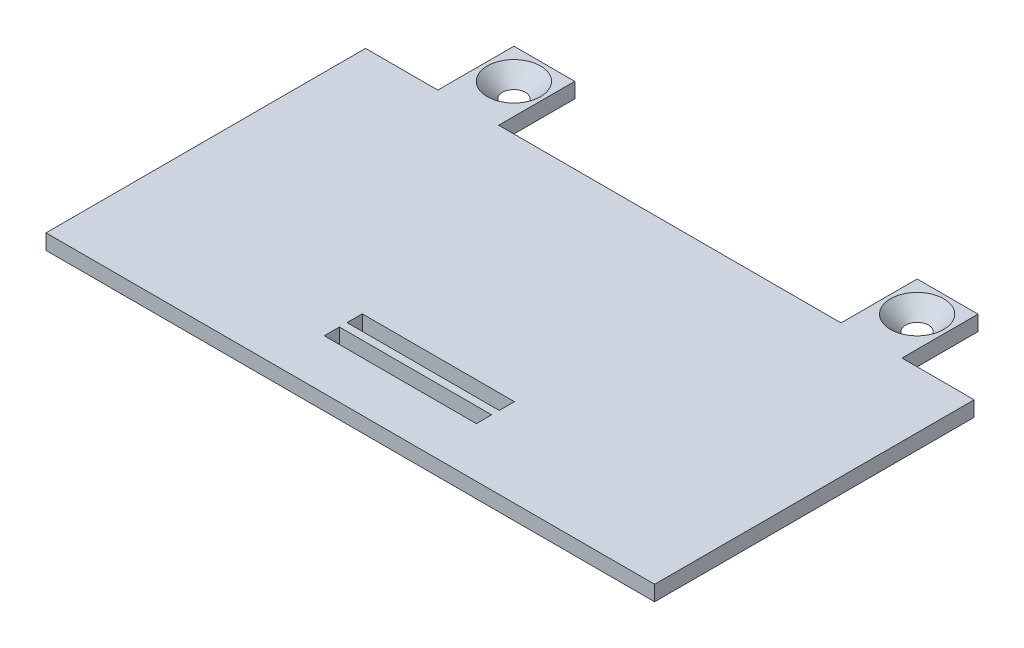
ISO-10303-21;
HEADER;
FILE_DESCRIPTION(('STEP AP214'),'2;1');
FILE_NAME('part.step','',(''),(''),'','','');
FILE_SCHEMA(('AUTOMOTIVE_DESIGN { 1 0 10303 214 1 1 1 1 }'));
ENDSEC;
DATA;
#1=APPLICATION_CONTEXT('core data for automotive mechanical design processes');
#2=APPLICATION_PROTOCOL_DEFINITION('international standard','automotive_design',2000,#1);
#3=PRODUCT_CONTEXT('',#1,'mechanical');
#4=PRODUCT('Part','Part','',(#3));
#5=PRODUCT_RELATED_PRODUCT_CATEGORY('part','',(#4));
#6=PRODUCT_DEFINITION_FORMATION('','',#4);
#7=PRODUCT_DEFINITION_CONTEXT('part definition',#1,'design');
#8=PRODUCT_DEFINITION('design','',#6,#7);
#9=PRODUCT_DEFINITION_SHAPE('','',#8);
#10=(LENGTH_UNIT() NAMED_UNIT(*) SI_UNIT(.MILLI.,.METRE.));
#11=(NAMED_UNIT(*) PLANE_ANGLE_UNIT() SI_UNIT($,.RADIAN.));
#12=(NAMED_UNIT(*) SI_UNIT($,.STERADIAN.) SOLID_ANGLE_UNIT());
#13=UNCERTAINTY_MEASURE_WITH_UNIT(LENGTH_MEASURE(1.E-05),#10,'distance_accuracy_value','');
#14=(GEOMETRIC_REPRESENTATION_CONTEXT(3) GLOBAL_UNCERTAINTY_ASSIGNED_CONTEXT((#13)) GLOBAL_UNIT_ASSIGNED_CONTEXT((#10,
#11,#12)) REPRESENTATION_CONTEXT('',''));
#15=CARTESIAN_POINT('',(0.,0.,0.));
#16=DIRECTION('',(0.,0.,1.));
#17=DIRECTION('',(1.,0.,0.));
#18=AXIS2_PLACEMENT_3D('',#15,#16,#17);
#19=CARTESIAN_POINT('',(-36.8821964652426,-2.,-61.3775431410421));
#20=DIRECTION('',(0.,0.,-1.));
#21=DIRECTION('',(-1.,0.,0.));
#22=AXIS2_PLACEMENT_3D('',#19,#20,#21);
#23=PLANE('',#22);
#24=DIRECTION('',(-1.,0.,0.));
#25=VECTOR('',#24,1.);
#26=CARTESIAN_POINT('',(-36.8821964652426,0.,-61.3775431410421));
#27=LINE('',#26,#25);
#28=CARTESIAN_POINT('',(33.6178035347574,0.,-61.3775431410421));
#29=VERTEX_POINT('',#28);
#30=CARTESIAN_POINT('',(25.6178035347574,0.,-61.3775431410421));
#31=VERTEX_POINT('',#30);
#32=EDGE_CURVE('E300',#29,#31,#27,.T.);
#33=ORIENTED_EDGE('',*,*,#32,.F.);
#34=DIRECTION('',(0.,-1.,0.));
#35=VECTOR('',#34,1.);
#36=CARTESIAN_POINT('',(33.6178035347574,64.,-61.3775431410421));
#37=LINE('',#36,#35);
#38=CARTESIAN_POINT('',(33.6178035347574,-2.,-61.3775431410421));
#39=VERTEX_POINT('',#38);
#40=EDGE_CURVE('E254',#29,#39,#37,.T.);
#41=ORIENTED_EDGE('',*,*,#40,.T.);
#42=DIRECTION('',(-1.,0.,0.));
#43=VECTOR('',#42,1.);
#44=CARTESIAN_POINT('',(-36.8821964652426,-2.,-61.3775431410421));
#45=LINE('',#44,#43);
#46=CARTESIAN_POINT('',(25.6178035347574,-2.,-61.3775431410421));
#47=VERTEX_POINT('',#46);
#48=EDGE_CURVE('E307',#39,#47,#45,.T.);
#49=ORIENTED_EDGE('',*,*,#48,.T.);
#50=DIRECTION('',(0.,-1.,0.));
#51=VECTOR('',#50,1.);
#52=CARTESIAN_POINT('',(25.6178035347574,54.,-61.3775431410421));
#53=LINE('',#52,#51);
#54=EDGE_CURVE('E267',#31,#47,#53,.T.);
#55=ORIENTED_EDGE('',*,*,#54,.F.);
#56=EDGE_LOOP('',(#33,#41,#49,#55));
#57=FACE_BOUND('',#56,.T.);
#58=ADVANCED_FACE('F37',(#57),#23,.T.);
#59=CARTESIAN_POINT('',(0.,-2.,0.));
#60=DIRECTION('',(0.,1.,0.));
#61=DIRECTION('',(0.,0.,1.));
#62=AXIS2_PLACEMENT_3D('',#59,#60,#61);
#63=PLANE('',#62);
#64=DIRECTION('',(-1.,0.,0.));
#65=VECTOR('',#64,1.);
#66=CARTESIAN_POINT('',(-6.88219646524261,-1.99999999999995,-17.9462363350968));
#67=LINE('',#66,#65);
#68=CARTESIAN_POINT('',(13.1178035347574,-1.99999999999995,-17.9462363350969));
#69=VERTEX_POINT('',#68);
#70=CARTESIAN_POINT('',(-6.88219646524261,-1.99999999999995,-17.9462363350968));
#71=VERTEX_POINT('',#70);
#72=EDGE_CURVE('E187',#69,#71,#67,.T.);
#73=ORIENTED_EDGE('',*,*,#72,.T.);
#74=DIRECTION('',(0.,0.,1.));
#75=VECTOR('',#74,1.);
#76=CARTESIAN_POINT('',(-6.88219646524261,-1.99999999999995,-17.9462363350968));
#77=LINE('',#76,#75);
#78=CARTESIAN_POINT('',(-6.88219646524261,-1.99999999999995,-15.9462363350968));
#79=VERTEX_POINT('',#78);
#80=EDGE_CURVE('E179',#71,#79,#77,.T.);
#81=ORIENTED_EDGE('',*,*,#80,.T.);
#82=DIRECTION('',(1.,0.,0.));
#83=VECTOR('',#82,1.);
#84=CARTESIAN_POINT('',(-6.88219646524261,-1.99999999999995,-15.9462363350968));
#85=LINE('',#84,#83);
#86=CARTESIAN_POINT('',(13.1178035347574,-2.,-15.9462363350968));
#87=VERTEX_POINT('',#86);
#88=EDGE_CURVE('E190',#79,#87,#85,.T.);
#89=ORIENTED_EDGE('',*,*,#88,.T.);
#90=DIRECTION('',(0.,0.,-1.));
#91=VECTOR('',#90,1.);
#92=CARTESIAN_POINT('',(13.1178035347574,-1.99999999999995,-17.9462363350969));
#93=LINE('',#92,#91);
#94=EDGE_CURVE('E53',#87,#69,#93,.T.);
#95=ORIENTED_EDGE('',*,*,#94,.T.);
#96=EDGE_LOOP('',(#73,#81,#89,#95));
#97=FACE_BOUND('',#96,.T.);
#98=DIRECTION('',(-1.,0.,0.));
#99=VECTOR('',#98,1.);
#100=CARTESIAN_POINT('',(-6.88219646524261,-1.99999999999995,-20.9462363350968));
#101=LINE('',#100,#99);
#102=CARTESIAN_POINT('',(13.1178035347574,-1.99999999999995,-20.9462363350968));
#103=VERTEX_POINT('',#102);
#104=CARTESIAN_POINT('',(-6.88219646524261,-1.99999999999995,-20.9462363350968));
#105=VERTEX_POINT('',#104);
#106=EDGE_CURVE('E225',#103,#105,#101,.T.);
#107=ORIENTED_EDGE('',*,*,#106,.T.);
#108=DIRECTION('',(0.,0.,1.));
#109=VECTOR('',#108,1.);
#110=CARTESIAN_POINT('',(-6.88219646524261,-1.99999999999995,-20.9462363350968));
#111=LINE('',#110,#109);
#112=CARTESIAN_POINT('',(-6.88219646524261,-1.99999999999995,-18.9462363350968));
#113=VERTEX_POINT('',#112);
#114=EDGE_CURVE('E217',#105,#113,#111,.T.);
#115=ORIENTED_EDGE('',*,*,#114,.T.);
#116=DIRECTION('',(1.,0.,0.));
#117=VECTOR('',#116,1.);
#118=CARTESIAN_POINT('',(-6.88219646524261,-1.99999999999995,-18.9462363350968));
#119=LINE('',#118,#117);
#120=CARTESIAN_POINT('',(13.1178035347574,-2.,-18.9462363350968));
#121=VERTEX_POINT('',#120);
#122=EDGE_CURVE('E220',#113,#121,#119,.T.);
#123=ORIENTED_EDGE('',*,*,#122,.T.);
#124=DIRECTION('',(0.,0.,-1.));
#125=VECTOR('',#124,1.);
#126=CARTESIAN_POINT('',(13.1178035347574,-1.99999999999995,-20.9462363350968));
#127=LINE('',#126,#125);
#128=EDGE_CURVE('E61',#121,#103,#127,.T.);
#129=ORIENTED_EDGE('',*,*,#128,.T.);
#130=EDGE_LOOP('',(#107,#115,#123,#129));
#131=FACE_BOUND('',#130,.T.);
#132=CARTESIAN_POINT('',(29.6178035347574,-2.,-57.3775431410421));
#133=DIRECTION('',(0.,1.,0.));
#134=DIRECTION('',(0.,0.,1.));
#135=AXIS2_PLACEMENT_3D('',#132,#133,#134);
#136=CIRCLE('',#135,1.5);
#137=CARTESIAN_POINT('',(29.6178035347574,-2.,-55.8775431410421));
#138=VERTEX_POINT('',#137);
#139=EDGE_CURVE('E213',#138,#138,#136,.F.);
#140=ORIENTED_EDGE('',*,*,#139,.F.);
#141=EDGE_LOOP('',(#140));
#142=FACE_BOUND('',#141,.T.);
#143=CARTESIAN_POINT('',(-23.3821964652426,-2.,-57.3775431410421));
#144=DIRECTION('',(0.,1.,0.));
#145=DIRECTION('',(0.,0.,1.));
#146=AXIS2_PLACEMENT_3D('',#143,#144,#145);
#147=CIRCLE('',#146,1.5);
#148=CARTESIAN_POINT('',(-23.3821964652426,-2.,-55.8775431410421));
#149=VERTEX_POINT('',#148);
#150=EDGE_CURVE('E248',#149,#149,#147,.F.);
#151=ORIENTED_EDGE('',*,*,#150,.F.);
#152=EDGE_LOOP('',(#151));
#153=FACE_BOUND('',#152,.T.);
#154=DIRECTION('',(0.,0.,-1.));
#155=VECTOR('',#154,1.);
#156=CARTESIAN_POINT('',(33.6178035347574,-2.,0.));
#157=LINE('',#156,#155);
#158=CARTESIAN_POINT('',(33.6178035347574,-2.,-51.3775431410421));
#159=VERTEX_POINT('',#158);
#160=EDGE_CURVE('E262',#159,#39,#157,.T.);
#161=ORIENTED_EDGE('',*,*,#160,.F.);
#162=DIRECTION('',(-1.,0.,0.));
#163=VECTOR('',#162,1.);
#164=CARTESIAN_POINT('',(0.,-2.,-51.3775431410421));
#165=LINE('',#164,#163);
#166=CARTESIAN_POINT('',(43.1178035347574,-2.,-51.3775431410421));
#167=VERTEX_POINT('',#166);
#168=EDGE_CURVE('E260',#167,#159,#165,.T.);
#169=ORIENTED_EDGE('',*,*,#168,.F.);
#170=DIRECTION('',(0.,0.,-1.));
#171=VECTOR('',#170,1.);
#172=CARTESIAN_POINT('',(43.1178035347574,-2.,-61.3775431410421));
#173=LINE('',#172,#171);
#174=CARTESIAN_POINT('',(43.1178035347574,-2.,-9.37754314104211));
#175=VERTEX_POINT('',#174);
#176=EDGE_CURVE('E303',#175,#167,#173,.T.);
#177=ORIENTED_EDGE('',*,*,#176,.F.);
#178=DIRECTION('',(1.,0.,0.));
#179=VECTOR('',#178,1.);
#180=CARTESIAN_POINT('',(-36.8821964652426,-2.,-9.37754314104211));
#181=LINE('',#180,#179);
#182=CARTESIAN_POINT('',(-36.8821964652426,-2.,-9.37754314104211));
#183=VERTEX_POINT('',#182);
#184=EDGE_CURVE('E299',#183,#175,#181,.T.);
#185=ORIENTED_EDGE('',*,*,#184,.F.);
#186=DIRECTION('',(0.,0.,1.));
#187=VECTOR('',#186,1.);
#188=CARTESIAN_POINT('',(-36.8821964652426,-2.,-61.3775431410421));
#189=LINE('',#188,#187);
#190=CARTESIAN_POINT('',(-36.8821964652426,-2.,-51.3775431410421));
#191=VERTEX_POINT('',#190);
#192=EDGE_CURVE('E297',#191,#183,#189,.T.);
#193=ORIENTED_EDGE('',*,*,#192,.F.);
#194=DIRECTION('',(1.,0.,0.));
#195=VECTOR('',#194,1.);
#196=CARTESIAN_POINT('',(0.,-2.,-51.3775431410421));
#197=LINE('',#196,#195);
#198=CARTESIAN_POINT('',(-27.3821964652426,-2.,-51.3775431410421));
#199=VERTEX_POINT('',#198);
#200=EDGE_CURVE('E286',#191,#199,#197,.T.);
#201=ORIENTED_EDGE('',*,*,#200,.T.);
#202=DIRECTION('',(0.,0.,-1.));
#203=VECTOR('',#202,1.);
#204=CARTESIAN_POINT('',(-27.3821964652426,-2.,0.));
#205=LINE('',#204,#203);
#206=CARTESIAN_POINT('',(-27.3821964652426,-2.,-61.3775431410421));
#207=VERTEX_POINT('',#206);
#208=EDGE_CURVE('E293',#199,#207,#205,.T.);
#209=ORIENTED_EDGE('',*,*,#208,.T.);
#210=CARTESIAN_POINT('',(-19.3821964652426,-2.,-61.3775431410421));
#211=VERTEX_POINT('',#210);
#212=EDGE_CURVE('E306',#211,#207,#45,.T.);
#213=ORIENTED_EDGE('',*,*,#212,.F.);
#214=DIRECTION('',(0.,0.,-1.));
#215=VECTOR('',#214,1.);
#216=CARTESIAN_POINT('',(-19.3821964652426,-2.,0.));
#217=LINE('',#216,#215);
#218=CARTESIAN_POINT('',(-19.3821964652426,-2.,-51.3775431410421));
#219=VERTEX_POINT('',#218);
#220=EDGE_CURVE('E280',#219,#211,#217,.T.);
#221=ORIENTED_EDGE('',*,*,#220,.F.);
#222=DIRECTION('',(-1.,0.,0.));
#223=VECTOR('',#222,1.);
#224=CARTESIAN_POINT('',(0.,-2.,-51.3775431410421));
#225=LINE('',#224,#223);
#226=CARTESIAN_POINT('',(25.6178035347574,-2.,-51.3775431410421));
#227=VERTEX_POINT('',#226);
#228=EDGE_CURVE('E278',#227,#219,#225,.T.);
#229=ORIENTED_EDGE('',*,*,#228,.F.);
#230=DIRECTION('',(0.,0.,1.));
#231=VECTOR('',#230,1.);
#232=CARTESIAN_POINT('',(25.6178035347574,-2.,0.));
#233=LINE('',#232,#231);
#234=EDGE_CURVE('E276',#47,#227,#233,.T.);
#235=ORIENTED_EDGE('',*,*,#234,.F.);
#236=ORIENTED_EDGE('',*,*,#48,.F.);
#237=EDGE_LOOP('',(#161,#169,#177,#185,#193,#201,#209,#213,#221,#229,#235,#236));
#238=FACE_BOUND('',#237,.T.);
#239=ADVANCED_FACE('F194',(#97,#131,#142,#153,#238),#63,.F.);
#240=CARTESIAN_POINT('',(0.,0.,0.));
#241=DIRECTION('',(0.,1.,0.));
#242=DIRECTION('',(0.,0.,1.));
#243=AXIS2_PLACEMENT_3D('',#240,#241,#242);
#244=PLANE('',#243);
#245=DIRECTION('',(0.,0.,1.));
#246=VECTOR('',#245,1.);
#247=CARTESIAN_POINT('',(-6.88219646524261,0.,-17.9462363350968));
#248=LINE('',#247,#246);
#249=CARTESIAN_POINT('',(-6.88219646524261,0.,-17.9462363350968));
#250=VERTEX_POINT('',#249);
#251=CARTESIAN_POINT('',(-6.88219646524261,0.,-15.9462363350968));
#252=VERTEX_POINT('',#251);
#253=EDGE_CURVE('E182',#250,#252,#248,.T.);
#254=ORIENTED_EDGE('',*,*,#253,.F.);
#255=DIRECTION('',(-1.,0.,0.));
#256=VECTOR('',#255,1.);
#257=CARTESIAN_POINT('',(-6.88219646524261,0.,-17.9462363350968));
#258=LINE('',#257,#256);
#259=CARTESIAN_POINT('',(13.1178035347574,0.,-17.9462363350969));
#260=VERTEX_POINT('',#259);
#261=EDGE_CURVE('E197',#260,#250,#258,.T.);
#262=ORIENTED_EDGE('',*,*,#261,.F.);
#263=DIRECTION('',(0.,0.,-1.));
#264=VECTOR('',#263,1.);
#265=CARTESIAN_POINT('',(13.1178035347574,0.,-17.9462363350969));
#266=LINE('',#265,#264);
#267=CARTESIAN_POINT('',(13.1178035347574,0.,-15.9462363350968));
#268=VERTEX_POINT('',#267);
#269=EDGE_CURVE('E200',#268,#260,#266,.T.);
#270=ORIENTED_EDGE('',*,*,#269,.F.);
#271=DIRECTION('',(1.,0.,0.));
#272=VECTOR('',#271,1.);
#273=CARTESIAN_POINT('',(-6.88219646524261,0.,-15.9462363350968));
#274=LINE('',#273,#272);
#275=EDGE_CURVE('E206',#252,#268,#274,.T.);
#276=ORIENTED_EDGE('',*,*,#275,.F.);
#277=EDGE_LOOP('',(#254,#262,#270,#276));
#278=FACE_BOUND('',#277,.T.);
#279=DIRECTION('',(0.,0.,1.));
#280=VECTOR('',#279,1.);
#281=CARTESIAN_POINT('',(-6.88219646524261,0.,-20.9462363350968));
#282=LINE('',#281,#280);
#283=CARTESIAN_POINT('',(-6.88219646524261,0.,-20.9462363350968));
#284=VERTEX_POINT('',#283);
#285=CARTESIAN_POINT('',(-6.88219646524261,0.,-18.9462363350968));
#286=VERTEX_POINT('',#285);
#287=EDGE_CURVE('E229',#284,#286,#282,.T.);
#288=ORIENTED_EDGE('',*,*,#287,.F.);
#289=DIRECTION('',(-1.,0.,0.));
#290=VECTOR('',#289,1.);
#291=CARTESIAN_POINT('',(-6.88219646524261,0.,-20.9462363350968));
#292=LINE('',#291,#290);
#293=CARTESIAN_POINT('',(13.1178035347574,0.,-20.9462363350968));
#294=VERTEX_POINT('',#293);
#295=EDGE_CURVE('E221',#294,#284,#292,.T.);
#296=ORIENTED_EDGE('',*,*,#295,.F.);
#297=DIRECTION('',(0.,0.,-1.));
#298=VECTOR('',#297,1.);
#299=CARTESIAN_POINT('',(13.1178035347574,0.,-20.9462363350968));
#300=LINE('',#299,#298);
#301=CARTESIAN_POINT('',(13.1178035347574,0.,-18.9462363350968));
#302=VERTEX_POINT('',#301);
#303=EDGE_CURVE('E234',#302,#294,#300,.T.);
#304=ORIENTED_EDGE('',*,*,#303,.F.);
#305=DIRECTION('',(1.,0.,0.));
#306=VECTOR('',#305,1.);
#307=CARTESIAN_POINT('',(-6.88219646524261,0.,-18.9462363350968));
#308=LINE('',#307,#306);
#309=EDGE_CURVE('E231',#286,#302,#308,.T.);
#310=ORIENTED_EDGE('',*,*,#309,.F.);
#311=EDGE_LOOP('',(#288,#296,#304,#310));
#312=FACE_BOUND('',#311,.T.);
#313=CARTESIAN_POINT('',(29.6178035347574,0.,-57.3775431410421));
#314=DIRECTION('',(0.,1.,0.));
#315=DIRECTION('',(0.,0.,1.));
#316=AXIS2_PLACEMENT_3D('',#313,#314,#315);
#317=CIRCLE('',#316,3.49999999999999);
#318=CARTESIAN_POINT('',(29.6178035347574,0.,-53.8775431410421));
#319=VERTEX_POINT('',#318);
#320=EDGE_CURVE('E11',#319,#319,#317,.F.);
#321=ORIENTED_EDGE('',*,*,#320,.T.);
#322=EDGE_LOOP('',(#321));
#323=FACE_BOUND('',#322,.T.);
#324=CARTESIAN_POINT('',(-23.3821964652426,0.,-57.3775431410421));
#325=DIRECTION('',(0.,1.,0.));
#326=DIRECTION('',(0.,0.,1.));
#327=AXIS2_PLACEMENT_3D('',#324,#325,#326);
#328=CIRCLE('',#327,3.49999999999999);
#329=CARTESIAN_POINT('',(-23.3821964652426,0.,-53.8775431410421));
#330=VERTEX_POINT('',#329);
#331=EDGE_CURVE('E46',#330,#330,#328,.F.);
#332=ORIENTED_EDGE('',*,*,#331,.T.);
#333=EDGE_LOOP('',(#332));
#334=FACE_BOUND('',#333,.T.);
#335=DIRECTION('',(-1.,0.,0.));
#336=VECTOR('',#335,1.);
#337=CARTESIAN_POINT('',(0.,0.,-51.3775431410421));
#338=LINE('',#337,#336);
#339=CARTESIAN_POINT('',(43.1178035347574,0.,-51.3775431410421));
#340=VERTEX_POINT('',#339);
#341=CARTESIAN_POINT('',(33.6178035347574,0.,-51.3775431410421));
#342=VERTEX_POINT('',#341);
#343=EDGE_CURVE('E257',#340,#342,#338,.T.);
#344=ORIENTED_EDGE('',*,*,#343,.T.);
#345=DIRECTION('',(0.,0.,-1.));
#346=VECTOR('',#345,1.);
#347=CARTESIAN_POINT('',(33.6178035347574,0.,0.));
#348=LINE('',#347,#346);
#349=EDGE_CURVE('E340',#342,#29,#348,.T.);
#350=ORIENTED_EDGE('',*,*,#349,.T.);
#351=ORIENTED_EDGE('',*,*,#32,.T.);
#352=DIRECTION('',(0.,0.,1.));
#353=VECTOR('',#352,1.);
#354=CARTESIAN_POINT('',(25.6178035347574,0.,0.));
#355=LINE('',#354,#353);
#356=CARTESIAN_POINT('',(25.6178035347574,0.,-51.3775431410421));
#357=VERTEX_POINT('',#356);
#358=EDGE_CURVE('E328',#31,#357,#355,.T.);
#359=ORIENTED_EDGE('',*,*,#358,.T.);
#360=DIRECTION('',(-1.,0.,0.));
#361=VECTOR('',#360,1.);
#362=CARTESIAN_POINT('',(0.,0.,-51.3775431410421));
#363=LINE('',#362,#361);
#364=CARTESIAN_POINT('',(-19.3821964652426,0.,-51.3775431410421));
#365=VERTEX_POINT('',#364);
#366=EDGE_CURVE('E331',#357,#365,#363,.T.);
#367=ORIENTED_EDGE('',*,*,#366,.T.);
#368=DIRECTION('',(0.,0.,-1.));
#369=VECTOR('',#368,1.);
#370=CARTESIAN_POINT('',(-19.3821964652426,0.,0.));
#371=LINE('',#370,#369);
#372=CARTESIAN_POINT('',(-19.3821964652426,0.,-61.3775431410421));
#373=VERTEX_POINT('',#372);
#374=EDGE_CURVE('E334',#365,#373,#371,.T.);
#375=ORIENTED_EDGE('',*,*,#374,.T.);
#376=CARTESIAN_POINT('',(-27.3821964652426,0.,-61.3775431410421));
#377=VERTEX_POINT('',#376);
#378=EDGE_CURVE('E317',#373,#377,#27,.T.);
#379=ORIENTED_EDGE('',*,*,#378,.T.);
#380=DIRECTION('',(0.,0.,-1.));
#381=VECTOR('',#380,1.);
#382=CARTESIAN_POINT('',(-27.3821964652426,0.,0.));
#383=LINE('',#382,#381);
#384=CARTESIAN_POINT('',(-27.3821964652426,0.,-51.3775431410421));
#385=VERTEX_POINT('',#384);
#386=EDGE_CURVE('E325',#385,#377,#383,.T.);
#387=ORIENTED_EDGE('',*,*,#386,.F.);
#388=DIRECTION('',(1.,0.,0.));
#389=VECTOR('',#388,1.);
#390=CARTESIAN_POINT('',(0.,0.,-51.3775431410421));
#391=LINE('',#390,#389);
#392=CARTESIAN_POINT('',(-36.8821964652426,0.,-51.3775431410421));
#393=VERTEX_POINT('',#392);
#394=EDGE_CURVE('E321',#393,#385,#391,.T.);
#395=ORIENTED_EDGE('',*,*,#394,.F.);
#396=DIRECTION('',(0.,0.,1.));
#397=VECTOR('',#396,1.);
#398=CARTESIAN_POINT('',(-36.8821964652426,0.,-61.3775431410421));
#399=LINE('',#398,#397);
#400=CARTESIAN_POINT('',(-36.8821964652426,0.,-9.37754314104211));
#401=VERTEX_POINT('',#400);
#402=EDGE_CURVE('E296',#393,#401,#399,.T.);
#403=ORIENTED_EDGE('',*,*,#402,.T.);
#404=DIRECTION('',(1.,0.,0.));
#405=VECTOR('',#404,1.);
#406=CARTESIAN_POINT('',(-36.8821964652426,0.,-9.37754314104211));
#407=LINE('',#406,#405);
#408=CARTESIAN_POINT('',(43.1178035347574,0.,-9.37754314104211));
#409=VERTEX_POINT('',#408);
#410=EDGE_CURVE('E311',#401,#409,#407,.T.);
#411=ORIENTED_EDGE('',*,*,#410,.T.);
#412=DIRECTION('',(0.,0.,-1.));
#413=VECTOR('',#412,1.);
#414=CARTESIAN_POINT('',(43.1178035347574,0.,-61.3775431410421));
#415=LINE('',#414,#413);
#416=EDGE_CURVE('E314',#409,#340,#415,.T.);
#417=ORIENTED_EDGE('',*,*,#416,.T.);
#418=EDGE_LOOP('',(#344,#350,#351,#359,#367,#375,#379,#387,#395,#403,#411,#417));
#419=FACE_BOUND('',#418,.T.);
#420=ADVANCED_FACE('F345',(#278,#312,#323,#334,#419),#244,.T.);
#421=CARTESIAN_POINT('',(43.1178035347574,-2.,-61.3775431410421));
#422=DIRECTION('',(1.,0.,0.));
#423=DIRECTION('',(0.,0.,-1.));
#424=AXIS2_PLACEMENT_3D('',#421,#422,#423);
#425=PLANE('',#424);
#426=ORIENTED_EDGE('',*,*,#176,.T.);
#427=DIRECTION('',(0.,1.,0.));
#428=VECTOR('',#427,1.);
#429=CARTESIAN_POINT('',(43.1178035347574,-2.,-51.3775431410421));
#430=LINE('',#429,#428);
#431=EDGE_CURVE('E337',#167,#340,#430,.T.);
#432=ORIENTED_EDGE('',*,*,#431,.T.);
#433=ORIENTED_EDGE('',*,*,#416,.F.);
#434=DIRECTION('',(0.,1.,0.));
#435=VECTOR('',#434,1.);
#436=CARTESIAN_POINT('',(43.1178035347574,-2.,-9.37754314104211));
#437=LINE('',#436,#435);
#438=EDGE_CURVE('E319',#175,#409,#437,.T.);
#439=ORIENTED_EDGE('',*,*,#438,.F.);
#440=EDGE_LOOP('',(#426,#432,#433,#439));
#441=FACE_BOUND('',#440,.T.);
#442=ADVANCED_FACE('F376',(#441),#425,.T.);
#443=ORIENTED_EDGE('',*,*,#378,.F.);
#444=DIRECTION('',(0.,-1.,0.));
#445=VECTOR('',#444,1.);
#446=CARTESIAN_POINT('',(-19.3821964652426,54.,-61.3775431410421));
#447=LINE('',#446,#445);
#448=EDGE_CURVE('E264',#373,#211,#447,.T.);
#449=ORIENTED_EDGE('',*,*,#448,.T.);
#450=ORIENTED_EDGE('',*,*,#212,.T.);
#451=DIRECTION('',(0.,1.,0.));
#452=VECTOR('',#451,1.);
#453=CARTESIAN_POINT('',(-27.3821964652426,-32.,-61.3775431410421));
#454=LINE('',#453,#452);
#455=EDGE_CURVE('E283',#207,#377,#454,.T.);
#456=ORIENTED_EDGE('',*,*,#455,.T.);
#457=EDGE_LOOP('',(#443,#449,#450,#456));
#458=FACE_BOUND('',#457,.T.);
#459=ADVANCED_FACE('F366',(#458),#23,.T.);
#460=CARTESIAN_POINT('',(-36.8821964652426,-2.,-61.3775431410421));
#461=DIRECTION('',(-1.,0.,0.));
#462=DIRECTION('',(0.,0.,1.));
#463=AXIS2_PLACEMENT_3D('',#460,#461,#462);
#464=PLANE('',#463);
#465=DIRECTION('',(0.,1.,0.));
#466=VECTOR('',#465,1.);
#467=CARTESIAN_POINT('',(-36.8821964652426,-32.,-51.3775431410421));
#468=LINE('',#467,#466);
#469=EDGE_CURVE('E282',#191,#393,#468,.T.);
#470=ORIENTED_EDGE('',*,*,#469,.F.);
#471=ORIENTED_EDGE('',*,*,#192,.T.);
#472=DIRECTION('',(0.,1.,0.));
#473=VECTOR('',#472,1.);
#474=CARTESIAN_POINT('',(-36.8821964652426,-2.,-9.37754314104211));
#475=LINE('',#474,#473);
#476=EDGE_CURVE('E309',#183,#401,#475,.T.);
#477=ORIENTED_EDGE('',*,*,#476,.T.);
#478=ORIENTED_EDGE('',*,*,#402,.F.);
#479=EDGE_LOOP('',(#470,#471,#477,#478));
#480=FACE_BOUND('',#479,.T.);
#481=ADVANCED_FACE('F375',(#480),#464,.T.);
#482=CARTESIAN_POINT('',(-36.8821964652426,-2.,-9.37754314104211));
#483=DIRECTION('',(0.,0.,1.));
#484=DIRECTION('',(1.,0.,0.));
#485=AXIS2_PLACEMENT_3D('',#482,#483,#484);
#486=PLANE('',#485);
#487=ORIENTED_EDGE('',*,*,#410,.F.);
#488=ORIENTED_EDGE('',*,*,#476,.F.);
#489=ORIENTED_EDGE('',*,*,#184,.T.);
#490=ORIENTED_EDGE('',*,*,#438,.T.);
#491=EDGE_LOOP('',(#487,#488,#489,#490));
#492=FACE_BOUND('',#491,.T.);
#493=ADVANCED_FACE('F382',(#492),#486,.T.);
#494=CARTESIAN_POINT('',(-27.3821964652426,-32.,-61.3775431410421));
#495=DIRECTION('',(1.,0.,0.));
#496=DIRECTION('',(0.,0.,-1.));
#497=AXIS2_PLACEMENT_3D('',#494,#495,#496);
#498=PLANE('',#497);
#499=DIRECTION('',(0.,1.,0.));
#500=VECTOR('',#499,1.);
#501=CARTESIAN_POINT('',(-27.3821964652426,-32.,-51.3775431410421));
#502=LINE('',#501,#500);
#503=EDGE_CURVE('E287',#199,#385,#502,.T.);
#504=ORIENTED_EDGE('',*,*,#503,.T.);
#505=ORIENTED_EDGE('',*,*,#386,.T.);
#506=ORIENTED_EDGE('',*,*,#455,.F.);
#507=ORIENTED_EDGE('',*,*,#208,.F.);
#508=EDGE_LOOP('',(#504,#505,#506,#507));
#509=FACE_BOUND('',#508,.T.);
#510=ADVANCED_FACE('F391',(#509),#498,.F.);
#511=CARTESIAN_POINT('',(-36.8821964652426,-32.,-51.3775431410421));
#512=DIRECTION('',(0.,0.,1.));
#513=DIRECTION('',(1.,0.,0.));
#514=AXIS2_PLACEMENT_3D('',#511,#512,#513);
#515=PLANE('',#514);
#516=ORIENTED_EDGE('',*,*,#469,.T.);
#517=ORIENTED_EDGE('',*,*,#394,.T.);
#518=ORIENTED_EDGE('',*,*,#503,.F.);
#519=ORIENTED_EDGE('',*,*,#200,.F.);
#520=EDGE_LOOP('',(#516,#517,#518,#519));
#521=FACE_BOUND('',#520,.T.);
#522=ADVANCED_FACE('F394',(#521),#515,.F.);
#523=CARTESIAN_POINT('',(-19.3821964652426,54.,-61.3775431410421));
#524=DIRECTION('',(1.,0.,0.));
#525=DIRECTION('',(0.,0.,-1.));
#526=AXIS2_PLACEMENT_3D('',#523,#524,#525);
#527=PLANE('',#526);
#528=ORIENTED_EDGE('',*,*,#220,.T.);
#529=ORIENTED_EDGE('',*,*,#448,.F.);
#530=ORIENTED_EDGE('',*,*,#374,.F.);
#531=DIRECTION('',(0.,-1.,0.));
#532=VECTOR('',#531,1.);
#533=CARTESIAN_POINT('',(-19.3821964652426,54.,-51.3775431410421));
#534=LINE('',#533,#532);
#535=EDGE_CURVE('E273',#365,#219,#534,.T.);
#536=ORIENTED_EDGE('',*,*,#535,.T.);
#537=EDGE_LOOP('',(#528,#529,#530,#536));
#538=FACE_BOUND('',#537,.T.);
#539=ADVANCED_FACE('F422',(#538),#527,.T.);
#540=CARTESIAN_POINT('',(-19.3821964652426,54.,-51.3775431410421));
#541=DIRECTION('',(0.,0.,-1.));
#542=DIRECTION('',(-1.,0.,0.));
#543=AXIS2_PLACEMENT_3D('',#540,#541,#542);
#544=PLANE('',#543);
#545=ORIENTED_EDGE('',*,*,#228,.T.);
#546=ORIENTED_EDGE('',*,*,#535,.F.);
#547=ORIENTED_EDGE('',*,*,#366,.F.);
#548=DIRECTION('',(0.,-1.,0.));
#549=VECTOR('',#548,1.);
#550=CARTESIAN_POINT('',(25.6178035347574,54.,-51.3775431410421));
#551=LINE('',#550,#549);
#552=EDGE_CURVE('E270',#357,#227,#551,.T.);
#553=ORIENTED_EDGE('',*,*,#552,.T.);
#554=EDGE_LOOP('',(#545,#546,#547,#553));
#555=FACE_BOUND('',#554,.T.);
#556=ADVANCED_FACE('F419',(#555),#544,.T.);
#557=CARTESIAN_POINT('',(25.6178035347574,54.,-61.3775431410421));
#558=DIRECTION('',(-1.,0.,0.));
#559=DIRECTION('',(0.,0.,1.));
#560=AXIS2_PLACEMENT_3D('',#557,#558,#559);
#561=PLANE('',#560);
#562=ORIENTED_EDGE('',*,*,#234,.T.);
#563=ORIENTED_EDGE('',*,*,#552,.F.);
#564=ORIENTED_EDGE('',*,*,#358,.F.);
#565=ORIENTED_EDGE('',*,*,#54,.T.);
#566=EDGE_LOOP('',(#562,#563,#564,#565));
#567=FACE_BOUND('',#566,.T.);
#568=ADVANCED_FACE('F414',(#567),#561,.T.);
#569=CARTESIAN_POINT('',(33.6178035347574,64.,-61.3775431410421));
#570=DIRECTION('',(1.,0.,0.));
#571=DIRECTION('',(0.,0.,-1.));
#572=AXIS2_PLACEMENT_3D('',#569,#570,#571);
#573=PLANE('',#572);
#574=ORIENTED_EDGE('',*,*,#160,.T.);
#575=ORIENTED_EDGE('',*,*,#40,.F.);
#576=ORIENTED_EDGE('',*,*,#349,.F.);
#577=DIRECTION('',(0.,-1.,0.));
#578=VECTOR('',#577,1.);
#579=CARTESIAN_POINT('',(33.6178035347574,64.,-51.3775431410421));
#580=LINE('',#579,#578);
#581=EDGE_CURVE('E251',#342,#159,#580,.T.);
#582=ORIENTED_EDGE('',*,*,#581,.T.);
#583=EDGE_LOOP('',(#574,#575,#576,#582));
#584=FACE_BOUND('',#583,.T.);
#585=ADVANCED_FACE('F358',(#584),#573,.T.);
#586=CARTESIAN_POINT('',(43.1178035347574,64.,-51.3775431410421));
#587=DIRECTION('',(0.,0.,-1.));
#588=DIRECTION('',(-1.,0.,0.));
#589=AXIS2_PLACEMENT_3D('',#586,#587,#588);
#590=PLANE('',#589);
#591=ORIENTED_EDGE('',*,*,#168,.T.);
#592=ORIENTED_EDGE('',*,*,#581,.F.);
#593=ORIENTED_EDGE('',*,*,#343,.F.);
#594=ORIENTED_EDGE('',*,*,#431,.F.);
#595=EDGE_LOOP('',(#591,#592,#593,#594));
#596=FACE_BOUND('',#595,.T.);
#597=ADVANCED_FACE('F350',(#596),#590,.T.);
#598=CARTESIAN_POINT('',(-23.3821964652426,0.,-57.3775431410421));
#599=DIRECTION('',(0.,1.,0.));
#600=DIRECTION('',(0.,0.,1.));
#601=AXIS2_PLACEMENT_3D('',#598,#599,#600);
#602=CONICAL_SURFACE('',#601,3.49999999999999,0.785398163397447);
#603=ORIENTED_EDGE('',*,*,#150,.T.);
#604=EDGE_LOOP('',(#603));
#605=FACE_BOUND('',#604,.T.);
#606=ORIENTED_EDGE('',*,*,#331,.F.);
#607=EDGE_LOOP('',(#606));
#608=FACE_BOUND('',#607,.T.);
#609=ADVANCED_FACE('F348',(#605,#608),#602,.F.);
#610=CARTESIAN_POINT('',(29.6178035347574,0.,-57.3775431410421));
#611=DIRECTION('',(0.,1.,0.));
#612=DIRECTION('',(0.,0.,1.));
#613=AXIS2_PLACEMENT_3D('',#610,#611,#612);
#614=CONICAL_SURFACE('',#613,3.49999999999999,0.785398163397446);
#615=ORIENTED_EDGE('',*,*,#139,.T.);
#616=EDGE_LOOP('',(#615));
#617=FACE_BOUND('',#616,.T.);
#618=ORIENTED_EDGE('',*,*,#320,.F.);
#619=EDGE_LOOP('',(#618));
#620=FACE_BOUND('',#619,.T.);
#621=ADVANCED_FACE('F40',(#617,#620),#614,.F.);
#622=CARTESIAN_POINT('',(-6.88219646524261,-1.99999999999995,-20.9462363350968));
#623=DIRECTION('',(-1.,0.,0.));
#624=DIRECTION('',(0.,0.,1.));
#625=AXIS2_PLACEMENT_3D('',#622,#623,#624);
#626=PLANE('',#625);
#627=ORIENTED_EDGE('',*,*,#287,.T.);
#628=DIRECTION('',(0.,1.,0.));
#629=VECTOR('',#628,1.);
#630=CARTESIAN_POINT('',(-6.88219646524261,-1.99999999999995,-18.9462363350968));
#631=LINE('',#630,#629);
#632=EDGE_CURVE('E228',#113,#286,#631,.T.);
#633=ORIENTED_EDGE('',*,*,#632,.F.);
#634=ORIENTED_EDGE('',*,*,#114,.F.);
#635=DIRECTION('',(0.,1.,0.));
#636=VECTOR('',#635,1.);
#637=CARTESIAN_POINT('',(-6.88219646524261,-1.99999999999995,-20.9462363350968));
#638=LINE('',#637,#636);
#639=EDGE_CURVE('E207',#105,#284,#638,.T.);
#640=ORIENTED_EDGE('',*,*,#639,.T.);
#641=EDGE_LOOP('',(#627,#633,#634,#640));
#642=FACE_BOUND('',#641,.T.);
#643=ADVANCED_FACE('F356',(#642),#626,.F.);
#644=CARTESIAN_POINT('',(-6.88219646524261,-1.99999999999995,-20.9462363350968));
#645=DIRECTION('',(0.,0.,-1.));
#646=DIRECTION('',(-1.,0.,0.));
#647=AXIS2_PLACEMENT_3D('',#644,#645,#646);
#648=PLANE('',#647);
#649=ORIENTED_EDGE('',*,*,#295,.T.);
#650=ORIENTED_EDGE('',*,*,#639,.F.);
#651=ORIENTED_EDGE('',*,*,#106,.F.);
#652=DIRECTION('',(0.,1.,0.));
#653=VECTOR('',#652,1.);
#654=CARTESIAN_POINT('',(13.1178035347574,-1.99999999999995,-20.9462363350968));
#655=LINE('',#654,#653);
#656=EDGE_CURVE('E240',#103,#294,#655,.T.);
#657=ORIENTED_EDGE('',*,*,#656,.T.);
#658=EDGE_LOOP('',(#649,#650,#651,#657));
#659=FACE_BOUND('',#658,.T.);
#660=ADVANCED_FACE('F455',(#659),#648,.F.);
#661=CARTESIAN_POINT('',(13.1178035347574,-1.99999999999995,-20.9462363350968));
#662=DIRECTION('',(1.,0.,0.));
#663=DIRECTION('',(0.,0.,-1.));
#664=AXIS2_PLACEMENT_3D('',#661,#662,#663);
#665=PLANE('',#664);
#666=ORIENTED_EDGE('',*,*,#303,.T.);
#667=ORIENTED_EDGE('',*,*,#656,.F.);
#668=ORIENTED_EDGE('',*,*,#128,.F.);
#669=DIRECTION('',(0.,1.,0.));
#670=VECTOR('',#669,1.);
#671=CARTESIAN_POINT('',(13.1178035347574,-1.99999999999995,-18.9462363350968));
#672=LINE('',#671,#670);
#673=EDGE_CURVE('E242',#121,#302,#672,.T.);
#674=ORIENTED_EDGE('',*,*,#673,.T.);
#675=EDGE_LOOP('',(#666,#667,#668,#674));
#676=FACE_BOUND('',#675,.T.);
#677=ADVANCED_FACE('F456',(#676),#665,.F.);
#678=CARTESIAN_POINT('',(-6.88219646524261,-1.99999999999995,-18.9462363350968));
#679=DIRECTION('',(0.,0.,1.));
#680=DIRECTION('',(1.,0.,0.));
#681=AXIS2_PLACEMENT_3D('',#678,#679,#680);
#682=PLANE('',#681);
#683=ORIENTED_EDGE('',*,*,#309,.T.);
#684=ORIENTED_EDGE('',*,*,#673,.F.);
#685=ORIENTED_EDGE('',*,*,#122,.F.);
#686=ORIENTED_EDGE('',*,*,#632,.T.);
#687=EDGE_LOOP('',(#683,#684,#685,#686));
#688=FACE_BOUND('',#687,.T.);
#689=ADVANCED_FACE('F451',(#688),#682,.F.);
#690=CARTESIAN_POINT('',(-6.88219646524261,-1.99999999999995,-17.9462363350968));
#691=DIRECTION('',(-1.,0.,0.));
#692=DIRECTION('',(0.,0.,1.));
#693=AXIS2_PLACEMENT_3D('',#690,#691,#692);
#694=PLANE('',#693);
#695=ORIENTED_EDGE('',*,*,#253,.T.);
#696=DIRECTION('',(0.,1.,0.));
#697=VECTOR('',#696,1.);
#698=CARTESIAN_POINT('',(-6.88219646524261,-1.99999999999995,-15.9462363350968));
#699=LINE('',#698,#697);
#700=EDGE_CURVE('E175',#79,#252,#699,.T.);
#701=ORIENTED_EDGE('',*,*,#700,.F.);
#702=ORIENTED_EDGE('',*,*,#80,.F.);
#703=DIRECTION('',(0.,1.,0.));
#704=VECTOR('',#703,1.);
#705=CARTESIAN_POINT('',(-6.88219646524261,-1.99999999999995,-17.9462363350968));
#706=LINE('',#705,#704);
#707=EDGE_CURVE('E211',#71,#250,#706,.T.);
#708=ORIENTED_EDGE('',*,*,#707,.T.);
#709=EDGE_LOOP('',(#695,#701,#702,#708));
#710=FACE_BOUND('',#709,.T.);
#711=ADVANCED_FACE('F177',(#710),#694,.F.);
#712=CARTESIAN_POINT('',(-6.88219646524261,-1.99999999999995,-17.9462363350968));
#713=DIRECTION('',(0.,0.,-1.));
#714=DIRECTION('',(-1.,0.,0.));
#715=AXIS2_PLACEMENT_3D('',#712,#713,#714);
#716=PLANE('',#715);
#717=ORIENTED_EDGE('',*,*,#261,.T.);
#718=ORIENTED_EDGE('',*,*,#707,.F.);
#719=ORIENTED_EDGE('',*,*,#72,.F.);
#720=DIRECTION('',(0.,1.,0.));
#721=VECTOR('',#720,1.);
#722=CARTESIAN_POINT('',(13.1178035347574,-1.99999999999995,-17.9462363350969));
#723=LINE('',#722,#721);
#724=EDGE_CURVE('E214',#69,#260,#723,.T.);
#725=ORIENTED_EDGE('',*,*,#724,.T.);
#726=EDGE_LOOP('',(#717,#718,#719,#725));
#727=FACE_BOUND('',#726,.T.);
#728=ADVANCED_FACE('F537',(#727),#716,.F.);
#729=CARTESIAN_POINT('',(13.1178035347574,-1.99999999999995,-17.9462363350969));
#730=DIRECTION('',(1.,0.,0.));
#731=DIRECTION('',(0.,0.,-1.));
#732=AXIS2_PLACEMENT_3D('',#729,#730,#731);
#733=PLANE('',#732);
#734=ORIENTED_EDGE('',*,*,#269,.T.);
#735=ORIENTED_EDGE('',*,*,#724,.F.);
#736=ORIENTED_EDGE('',*,*,#94,.F.);
#737=DIRECTION('',(0.,1.,0.));
#738=VECTOR('',#737,1.);
#739=CARTESIAN_POINT('',(13.1178035347574,-1.99999999999995,-15.9462363350968));
#740=LINE('',#739,#738);
#741=EDGE_CURVE('E186',#87,#268,#740,.T.);
#742=ORIENTED_EDGE('',*,*,#741,.T.);
#743=EDGE_LOOP('',(#734,#735,#736,#742));
#744=FACE_BOUND('',#743,.T.);
#745=ADVANCED_FACE('F545',(#744),#733,.F.);
#746=CARTESIAN_POINT('',(-6.88219646524261,-1.99999999999995,-15.9462363350968));
#747=DIRECTION('',(0.,0.,1.));
#748=DIRECTION('',(1.,0.,0.));
#749=AXIS2_PLACEMENT_3D('',#746,#747,#748);
#750=PLANE('',#749);
#751=ORIENTED_EDGE('',*,*,#275,.T.);
#752=ORIENTED_EDGE('',*,*,#741,.F.);
#753=ORIENTED_EDGE('',*,*,#88,.F.);
#754=ORIENTED_EDGE('',*,*,#700,.T.);
#755=EDGE_LOOP('',(#751,#752,#753,#754));
#756=FACE_BOUND('',#755,.T.);
#757=ADVANCED_FACE('F191',(#756),#750,.F.);
#758=CLOSED_SHELL('',(#58,#239,#420,#442,#459,#481,#493,#510,#522,#539,#556,#568,#585,#597,#609,
#621,#643,#660,#677,#689,#711,#728,#745,#757));
#759=MANIFOLD_SOLID_BREP('B2',#758);
#760=ADVANCED_BREP_SHAPE_REPRESENTATION('',(#18,#759),#14);
#761=SHAPE_DEFINITION_REPRESENTATION(#9,#760);
ENDSEC;
END-ISO-10303-21;
